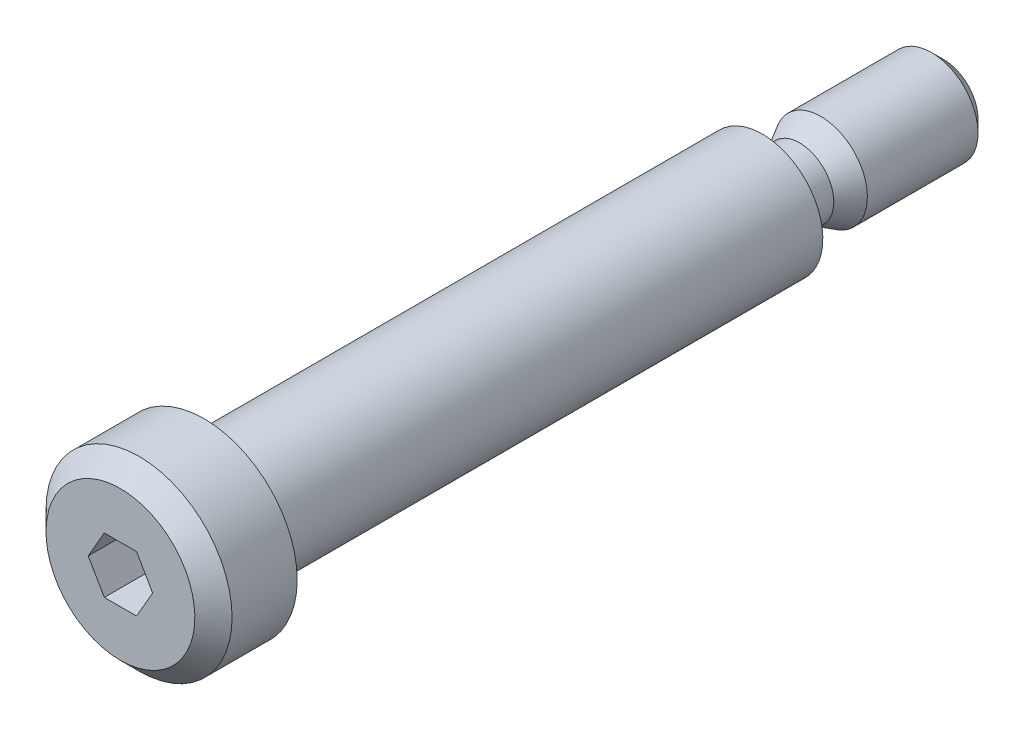
ISO-10303-21;
HEADER;
FILE_DESCRIPTION(('STEP AP214'),'2;1');
FILE_NAME('part.step','',(''),(''),'','','');
FILE_SCHEMA(('AUTOMOTIVE_DESIGN { 1 0 10303 214 1 1 1 1 }'));
ENDSEC;
DATA;
#1=APPLICATION_CONTEXT('core data for automotive mechanical design processes');
#2=APPLICATION_PROTOCOL_DEFINITION('international standard','automotive_design',2000,#1);
#3=PRODUCT_CONTEXT('',#1,'mechanical');
#4=PRODUCT('Part','Part','',(#3));
#5=PRODUCT_RELATED_PRODUCT_CATEGORY('part','',(#4));
#6=PRODUCT_DEFINITION_FORMATION('','',#4);
#7=PRODUCT_DEFINITION_CONTEXT('part definition',#1,'design');
#8=PRODUCT_DEFINITION('design','',#6,#7);
#9=PRODUCT_DEFINITION_SHAPE('','',#8);
#10=(LENGTH_UNIT() NAMED_UNIT(*) SI_UNIT(.MILLI.,.METRE.));
#11=(NAMED_UNIT(*) PLANE_ANGLE_UNIT() SI_UNIT($,.RADIAN.));
#12=(NAMED_UNIT(*) SI_UNIT($,.STERADIAN.) SOLID_ANGLE_UNIT());
#13=UNCERTAINTY_MEASURE_WITH_UNIT(LENGTH_MEASURE(1.E-05),#10,'distance_accuracy_value','');
#14=(GEOMETRIC_REPRESENTATION_CONTEXT(3) GLOBAL_UNCERTAINTY_ASSIGNED_CONTEXT((#13)) GLOBAL_UNIT_ASSIGNED_CONTEXT((#10,
#11,#12)) REPRESENTATION_CONTEXT('',''));
#15=CARTESIAN_POINT('',(0.,0.,0.));
#16=DIRECTION('',(0.,0.,1.));
#17=DIRECTION('',(1.,0.,0.));
#18=AXIS2_PLACEMENT_3D('',#15,#16,#17);
#19=CARTESIAN_POINT('',(0.,0.,-15.40625));
#20=DIRECTION('',(0.,0.,1.));
#21=DIRECTION('',(0.,-1.,0.));
#22=AXIS2_PLACEMENT_3D('',#19,#20,#21);
#23=CYLINDRICAL_SURFACE('',#22,3.25);
#24=CARTESIAN_POINT('',(0.,0.,-0.8125));
#25=DIRECTION('',(0.,0.,-1.));
#26=DIRECTION('',(0.,-1.,0.));
#27=AXIS2_PLACEMENT_3D('',#24,#25,#26);
#28=CIRCLE('',#27,3.25);
#29=CARTESIAN_POINT('',(0.,-3.25,-0.8125));
#30=VERTEX_POINT('',#29);
#31=EDGE_CURVE('E10',#30,#30,#28,.T.);
#32=ORIENTED_EDGE('',*,*,#31,.T.);
#33=EDGE_LOOP('',(#32));
#34=FACE_BOUND('',#33,.T.);
#35=CARTESIAN_POINT('',(0.,0.,-30.));
#36=DIRECTION('',(0.,0.,-1.));
#37=DIRECTION('',(0.,-1.,0.));
#38=AXIS2_PLACEMENT_3D('',#35,#36,#37);
#39=CIRCLE('',#38,3.25);
#40=CARTESIAN_POINT('',(0.,-3.25,-30.));
#41=VERTEX_POINT('',#40);
#42=EDGE_CURVE('E144',#41,#41,#39,.T.);
#43=ORIENTED_EDGE('',*,*,#42,.F.);
#44=EDGE_LOOP('',(#43));
#45=FACE_BOUND('',#44,.T.);
#46=ADVANCED_FACE('F16',(#34,#45),#23,.T.);
#47=CARTESIAN_POINT('',(0.,0.,-0.40625));
#48=DIRECTION('',(0.,0.,-1.));
#49=DIRECTION('',(-1.,0.,0.));
#50=AXIS2_PLACEMENT_3D('',#47,#48,#49);
#51=TOROIDAL_SURFACE('',#50,3.25,0.40625);
#52=CARTESIAN_POINT('',(0.,0.,0.));
#53=DIRECTION('',(0.,0.,-1.));
#54=DIRECTION('',(0.,-1.,0.));
#55=AXIS2_PLACEMENT_3D('',#52,#53,#54);
#56=CIRCLE('',#55,3.25);
#57=CARTESIAN_POINT('',(0.,-3.25,0.));
#58=VERTEX_POINT('',#57);
#59=EDGE_CURVE('E27',#58,#58,#56,.T.);
#60=ORIENTED_EDGE('',*,*,#59,.T.);
#61=EDGE_LOOP('',(#60));
#62=FACE_BOUND('',#61,.T.);
#63=ORIENTED_EDGE('',*,*,#31,.F.);
#64=EDGE_LOOP('',(#63));
#65=FACE_BOUND('',#64,.T.);
#66=ADVANCED_FACE('F288',(#62,#65),#51,.F.);
#67=CARTESIAN_POINT('',(0.,-4.125,0.));
#68=DIRECTION('',(0.,0.,-1.));
#69=DIRECTION('',(0.,-1.,0.));
#70=AXIS2_PLACEMENT_3D('',#67,#68,#69);
#71=PLANE('',#70);
#72=CARTESIAN_POINT('',(0.,0.,0.));
#73=DIRECTION('',(0.,0.,-1.));
#74=DIRECTION('',(0.,-1.,0.));
#75=AXIS2_PLACEMENT_3D('',#72,#73,#74);
#76=CIRCLE('',#75,5.);
#77=CARTESIAN_POINT('',(0.,-5.,0.));
#78=VERTEX_POINT('',#77);
#79=EDGE_CURVE('E112',#78,#78,#76,.T.);
#80=ORIENTED_EDGE('',*,*,#79,.T.);
#81=EDGE_LOOP('',(#80));
#82=FACE_BOUND('',#81,.T.);
#83=ORIENTED_EDGE('',*,*,#59,.F.);
#84=EDGE_LOOP('',(#83));
#85=FACE_BOUND('',#84,.T.);
#86=ADVANCED_FACE('F113',(#82,#85),#71,.T.);
#87=CARTESIAN_POINT('',(0.,0.,1.75));
#88=DIRECTION('',(0.,0.,1.));
#89=DIRECTION('',(0.,-1.,0.));
#90=AXIS2_PLACEMENT_3D('',#87,#88,#89);
#91=CYLINDRICAL_SURFACE('',#90,5.);
#92=CARTESIAN_POINT('',(0.,0.,3.5));
#93=DIRECTION('',(0.,0.,-1.));
#94=DIRECTION('',(0.,-1.,0.));
#95=AXIS2_PLACEMENT_3D('',#92,#93,#94);
#96=CIRCLE('',#95,5.);
#97=CARTESIAN_POINT('',(0.,-5.,3.5));
#98=VERTEX_POINT('',#97);
#99=EDGE_CURVE('E117',#98,#98,#96,.T.);
#100=ORIENTED_EDGE('',*,*,#99,.T.);
#101=EDGE_LOOP('',(#100));
#102=FACE_BOUND('',#101,.T.);
#103=ORIENTED_EDGE('',*,*,#79,.F.);
#104=EDGE_LOOP('',(#103));
#105=FACE_BOUND('',#104,.T.);
#106=ADVANCED_FACE('F309',(#102,#105),#91,.T.);
#107=CARTESIAN_POINT('',(0.,0.,4.));
#108=DIRECTION('',(0.,0.,-1.));
#109=DIRECTION('',(0.,-1.,0.));
#110=AXIS2_PLACEMENT_3D('',#107,#108,#109);
#111=CONICAL_SURFACE('',#110,4.5,0.785398163397448);
#112=CARTESIAN_POINT('',(0.,0.,4.5));
#113=DIRECTION('',(0.,0.,-1.));
#114=DIRECTION('',(0.,-1.,0.));
#115=AXIS2_PLACEMENT_3D('',#112,#113,#114);
#116=CIRCLE('',#115,4.);
#117=CARTESIAN_POINT('',(0.,-4.,4.5));
#118=VERTEX_POINT('',#117);
#119=EDGE_CURVE('E123',#118,#118,#116,.T.);
#120=ORIENTED_EDGE('',*,*,#119,.T.);
#121=EDGE_LOOP('',(#120));
#122=FACE_BOUND('',#121,.T.);
#123=ORIENTED_EDGE('',*,*,#99,.F.);
#124=EDGE_LOOP('',(#123));
#125=FACE_BOUND('',#124,.T.);
#126=ADVANCED_FACE('F312',(#122,#125),#111,.T.);
#127=CARTESIAN_POINT('',(0.,-2.,4.5));
#128=DIRECTION('',(0.,0.,1.));
#129=DIRECTION('',(0.,1.,0.));
#130=AXIS2_PLACEMENT_3D('',#127,#128,#129);
#131=PLANE('',#130);
#132=ORIENTED_EDGE('',*,*,#119,.F.);
#133=EDGE_LOOP('',(#132));
#134=FACE_BOUND('',#133,.T.);
#135=DIRECTION('',(-0.5,0.866025403784439,0.));
#136=VECTOR('',#135,1.);
#137=CARTESIAN_POINT('',(-0.86602479810778,-1.49999965031242,4.5));
#138=LINE('',#137,#136);
#139=CARTESIAN_POINT('',(-0.866025,-1.49999930062484,4.5));
#140=VERTEX_POINT('',#139);
#141=CARTESIAN_POINT('',(-1.73205,0.,4.5));
#142=VERTEX_POINT('',#141);
#143=EDGE_CURVE('E215',#140,#142,#138,.T.);
#144=ORIENTED_EDGE('',*,*,#143,.T.);
#145=DIRECTION('',(0.5,0.866025403784439,0.));
#146=VECTOR('',#145,1.);
#147=CARTESIAN_POINT('',(-1.73205020189222,-3.49687582223979E-07,4.5));
#148=LINE('',#147,#146);
#149=CARTESIAN_POINT('',(-0.866025,1.49999930062484,4.5));
#150=VERTEX_POINT('',#149);
#151=EDGE_CURVE('E180',#142,#150,#148,.T.);
#152=ORIENTED_EDGE('',*,*,#151,.T.);
#153=DIRECTION('',(1.,0.,0.));
#154=VECTOR('',#153,1.);
#155=CARTESIAN_POINT('',(0.,1.49999930062484,4.5));
#156=LINE('',#155,#154);
#157=CARTESIAN_POINT('',(0.866025,1.49999930062484,4.5));
#158=VERTEX_POINT('',#157);
#159=EDGE_CURVE('E222',#150,#158,#156,.T.);
#160=ORIENTED_EDGE('',*,*,#159,.T.);
#161=DIRECTION('',(0.5,-0.866025403784439,0.));
#162=VECTOR('',#161,1.);
#163=CARTESIAN_POINT('',(1.73205020189222,-3.4968758177989E-07,4.5));
#164=LINE('',#163,#162);
#165=CARTESIAN_POINT('',(1.73205,0.,4.5));
#166=VERTEX_POINT('',#165);
#167=EDGE_CURVE('E20',#158,#166,#164,.T.);
#168=ORIENTED_EDGE('',*,*,#167,.T.);
#169=DIRECTION('',(-0.5,-0.866025403784439,0.));
#170=VECTOR('',#169,1.);
#171=CARTESIAN_POINT('',(0.86602479810778,-1.49999965031242,4.5));
#172=LINE('',#171,#170);
#173=CARTESIAN_POINT('',(0.866025,-1.49999930062484,4.5));
#174=VERTEX_POINT('',#173);
#175=EDGE_CURVE('E184',#166,#174,#172,.T.);
#176=ORIENTED_EDGE('',*,*,#175,.T.);
#177=DIRECTION('',(-1.,0.,0.));
#178=VECTOR('',#177,1.);
#179=CARTESIAN_POINT('',(0.,-1.49999930062484,4.5));
#180=LINE('',#179,#178);
#181=EDGE_CURVE('E175',#174,#140,#180,.T.);
#182=ORIENTED_EDGE('',*,*,#181,.T.);
#183=EDGE_LOOP('',(#144,#152,#160,#168,#176,#182));
#184=FACE_BOUND('',#183,.T.);
#185=ADVANCED_FACE('F262',(#134,#184),#131,.T.);
#186=CARTESIAN_POINT('',(0.,0.,-38.1591604654721));
#187=DIRECTION('',(0.,0.,-1.));
#188=DIRECTION('',(0.,-1.,0.));
#189=AXIS2_PLACEMENT_3D('',#186,#187,#188);
#190=CONICAL_SURFACE('',#189,0.208333333333336,1.22173047639602);
#191=CARTESIAN_POINT('',(0.,0.,-38.2349875976109));
#192=DIRECTION('',(0.,0.,-1.));
#193=DIRECTION('',(0.,-1.,0.));
#194=AXIS2_PLACEMENT_3D('',#191,#192,#193);
#195=CIRCLE('',#194,0.416666666666667);
#196=CARTESIAN_POINT('',(0.,-0.416666666666667,-38.2349875976109));
#197=VERTEX_POINT('',#196);
#198=EDGE_CURVE('E142',#197,#197,#195,.T.);
#199=ORIENTED_EDGE('',*,*,#198,.T.);
#200=EDGE_LOOP('',(#199));
#201=FACE_BOUND('',#200,.T.);
#202=CARTESIAN_POINT('',(0.,0.,-38.0833333333333));
#203=VERTEX_POINT('',#202);
#204=VERTEX_LOOP('',#203);
#205=FACE_BOUND('',#204,.T.);
#206=ADVANCED_FACE('F322',(#201,#205),#190,.F.);
#207=CARTESIAN_POINT('',(0.,0.,-38.6841604654721));
#208=DIRECTION('',(0.,0.,1.));
#209=DIRECTION('',(0.,-1.,0.));
#210=AXIS2_PLACEMENT_3D('',#207,#208,#209);
#211=CYLINDRICAL_SURFACE('',#210,0.41666666666667);
#212=CARTESIAN_POINT('',(0.,0.,-39.1333333333334));
#213=DIRECTION('',(0.,0.,-1.));
#214=DIRECTION('',(0.,-1.,0.));
#215=AXIS2_PLACEMENT_3D('',#212,#213,#214);
#216=CIRCLE('',#215,0.416666666666672);
#217=CARTESIAN_POINT('',(0.,-0.416666666666672,-39.1333333333334));
#218=VERTEX_POINT('',#217);
#219=EDGE_CURVE('E136',#218,#218,#216,.T.);
#220=ORIENTED_EDGE('',*,*,#219,.T.);
#221=EDGE_LOOP('',(#220));
#222=FACE_BOUND('',#221,.T.);
#223=ORIENTED_EDGE('',*,*,#198,.F.);
#224=EDGE_LOOP('',(#223));
#225=FACE_BOUND('',#224,.T.);
#226=ADVANCED_FACE('F303',(#222,#225),#211,.F.);
#227=CARTESIAN_POINT('',(0.,0.,-39.4416666666667));
#228=DIRECTION('',(0.,0.,-1.));
#229=DIRECTION('',(0.,-1.,0.));
#230=AXIS2_PLACEMENT_3D('',#227,#228,#229);
#231=CONICAL_SURFACE('',#230,0.594682999666808,0.5235987755983);
#232=CARTESIAN_POINT('',(0.,0.,-39.75));
#233=DIRECTION('',(0.,0.,-1.));
#234=DIRECTION('',(0.,-1.,0.));
#235=AXIS2_PLACEMENT_3D('',#232,#233,#234);
#236=CIRCLE('',#235,0.772699332666945);
#237=CARTESIAN_POINT('',(0.,-0.772699332666945,-39.75));
#238=VERTEX_POINT('',#237);
#239=EDGE_CURVE('E143',#238,#238,#236,.T.);
#240=ORIENTED_EDGE('',*,*,#239,.T.);
#241=EDGE_LOOP('',(#240));
#242=FACE_BOUND('',#241,.T.);
#243=ORIENTED_EDGE('',*,*,#219,.F.);
#244=EDGE_LOOP('',(#243));
#245=FACE_BOUND('',#244,.T.);
#246=ADVANCED_FACE('F299',(#242,#245),#231,.F.);
#247=CARTESIAN_POINT('',(0.,-1.30634966633347,-39.75));
#248=DIRECTION('',(0.,0.,-1.));
#249=DIRECTION('',(0.,-1.,0.));
#250=AXIS2_PLACEMENT_3D('',#247,#248,#249);
#251=PLANE('',#250);
#252=CARTESIAN_POINT('',(0.,0.,-39.75));
#253=DIRECTION('',(0.,0.,-1.));
#254=DIRECTION('',(0.,-1.,0.));
#255=AXIS2_PLACEMENT_3D('',#252,#253,#254);
#256=CIRCLE('',#255,1.84);
#257=CARTESIAN_POINT('',(0.,-1.84,-39.75));
#258=VERTEX_POINT('',#257);
#259=EDGE_CURVE('E152',#258,#258,#256,.T.);
#260=ORIENTED_EDGE('',*,*,#259,.T.);
#261=EDGE_LOOP('',(#260));
#262=FACE_BOUND('',#261,.T.);
#263=ORIENTED_EDGE('',*,*,#239,.F.);
#264=EDGE_LOOP('',(#263));
#265=FACE_BOUND('',#264,.T.);
#266=ADVANCED_FACE('F302',(#262,#265),#251,.T.);
#267=CARTESIAN_POINT('',(0.,0.,-39.42));
#268=DIRECTION('',(0.,0.,1.));
#269=DIRECTION('',(0.,-1.,0.));
#270=AXIS2_PLACEMENT_3D('',#267,#268,#269);
#271=CONICAL_SURFACE('',#270,2.17,0.785398163397456);
#272=CARTESIAN_POINT('',(0.,0.,-39.09));
#273=DIRECTION('',(0.,0.,-1.));
#274=DIRECTION('',(0.,-1.,0.));
#275=AXIS2_PLACEMENT_3D('',#272,#273,#274);
#276=CIRCLE('',#275,2.5);
#277=CARTESIAN_POINT('',(0.,-2.5,-39.09));
#278=VERTEX_POINT('',#277);
#279=EDGE_CURVE('E149',#278,#278,#276,.T.);
#280=ORIENTED_EDGE('',*,*,#279,.T.);
#281=EDGE_LOOP('',(#280));
#282=FACE_BOUND('',#281,.T.);
#283=ORIENTED_EDGE('',*,*,#259,.F.);
#284=EDGE_LOOP('',(#283));
#285=FACE_BOUND('',#284,.T.);
#286=ADVANCED_FACE('F307',(#282,#285),#271,.T.);
#287=CARTESIAN_POINT('',(0.,0.,-36.1165767664978));
#288=DIRECTION('',(0.,0.,1.));
#289=DIRECTION('',(0.,-1.,0.));
#290=AXIS2_PLACEMENT_3D('',#287,#288,#289);
#291=CYLINDRICAL_SURFACE('',#290,2.5);
#292=CARTESIAN_POINT('',(0.,0.,-33.1431535329954));
#293=DIRECTION('',(0.,0.,-1.));
#294=DIRECTION('',(0.,-1.,0.));
#295=AXIS2_PLACEMENT_3D('',#292,#293,#294);
#296=CIRCLE('',#295,2.5);
#297=CARTESIAN_POINT('',(0.,-2.5,-33.1431535329954));
#298=VERTEX_POINT('',#297);
#299=EDGE_CURVE('E127',#298,#298,#296,.T.);
#300=ORIENTED_EDGE('',*,*,#299,.T.);
#301=EDGE_LOOP('',(#300));
#302=FACE_BOUND('',#301,.T.);
#303=ORIENTED_EDGE('',*,*,#279,.F.);
#304=EDGE_LOOP('',(#303));
#305=FACE_BOUND('',#304,.T.);
#306=ADVANCED_FACE('F336',(#302,#305),#291,.T.);
#307=CARTESIAN_POINT('',(0.,0.,-32.5715767664977));
#308=DIRECTION('',(0.,0.,-1.));
#309=DIRECTION('',(0.,-1.,0.));
#310=AXIS2_PLACEMENT_3D('',#307,#308,#309);
#311=CONICAL_SURFACE('',#310,2.17,0.523598775598299);
#312=CARTESIAN_POINT('',(0.,0.,-32.));
#313=DIRECTION('',(0.,0.,-1.));
#314=DIRECTION('',(0.,-1.,0.));
#315=AXIS2_PLACEMENT_3D('',#312,#313,#314);
#316=CIRCLE('',#315,1.84);
#317=CARTESIAN_POINT('',(0.,-1.84,-32.));
#318=VERTEX_POINT('',#317);
#319=EDGE_CURVE('E209',#318,#318,#316,.T.);
#320=ORIENTED_EDGE('',*,*,#319,.T.);
#321=EDGE_LOOP('',(#320));
#322=FACE_BOUND('',#321,.T.);
#323=ORIENTED_EDGE('',*,*,#299,.F.);
#324=EDGE_LOOP('',(#323));
#325=FACE_BOUND('',#324,.T.);
#326=ADVANCED_FACE('F329',(#322,#325),#311,.T.);
#327=CARTESIAN_POINT('',(0.,0.,-31.25));
#328=DIRECTION('',(0.,0.,1.));
#329=DIRECTION('',(0.,-1.,0.));
#330=AXIS2_PLACEMENT_3D('',#327,#328,#329);
#331=CYLINDRICAL_SURFACE('',#330,1.84);
#332=CARTESIAN_POINT('',(0.,0.,-30.5));
#333=DIRECTION('',(0.,0.,-1.));
#334=DIRECTION('',(0.,-1.,0.));
#335=AXIS2_PLACEMENT_3D('',#332,#333,#334);
#336=CIRCLE('',#335,1.84);
#337=CARTESIAN_POINT('',(0.,-1.84,-30.5));
#338=VERTEX_POINT('',#337);
#339=EDGE_CURVE('E147',#338,#338,#336,.T.);
#340=ORIENTED_EDGE('',*,*,#339,.T.);
#341=EDGE_LOOP('',(#340));
#342=FACE_BOUND('',#341,.T.);
#343=ORIENTED_EDGE('',*,*,#319,.F.);
#344=EDGE_LOOP('',(#343));
#345=FACE_BOUND('',#344,.T.);
#346=ADVANCED_FACE('F317',(#342,#345),#331,.T.);
#347=CARTESIAN_POINT('',(0.,0.,-30.5));
#348=DIRECTION('',(0.,0.,-1.));
#349=DIRECTION('',(-1.,0.,0.));
#350=AXIS2_PLACEMENT_3D('',#347,#348,#349);
#351=TOROIDAL_SURFACE('',#350,2.34,0.5);
#352=CARTESIAN_POINT('',(0.,0.,-30.));
#353=DIRECTION('',(0.,0.,-1.));
#354=DIRECTION('',(0.,-1.,0.));
#355=AXIS2_PLACEMENT_3D('',#352,#353,#354);
#356=CIRCLE('',#355,2.34);
#357=CARTESIAN_POINT('',(0.,-2.34,-30.));
#358=VERTEX_POINT('',#357);
#359=EDGE_CURVE('E148',#358,#358,#356,.T.);
#360=ORIENTED_EDGE('',*,*,#359,.T.);
#361=EDGE_LOOP('',(#360));
#362=FACE_BOUND('',#361,.T.);
#363=ORIENTED_EDGE('',*,*,#339,.F.);
#364=EDGE_LOOP('',(#363));
#365=FACE_BOUND('',#364,.T.);
#366=ADVANCED_FACE('F314',(#362,#365),#351,.F.);
#367=CARTESIAN_POINT('',(0.,-2.795,-30.));
#368=DIRECTION('',(0.,0.,-1.));
#369=DIRECTION('',(0.,-1.,0.));
#370=AXIS2_PLACEMENT_3D('',#367,#368,#369);
#371=PLANE('',#370);
#372=ORIENTED_EDGE('',*,*,#42,.T.);
#373=EDGE_LOOP('',(#372));
#374=FACE_BOUND('',#373,.T.);
#375=ORIENTED_EDGE('',*,*,#359,.F.);
#376=EDGE_LOOP('',(#375));
#377=FACE_BOUND('',#376,.T.);
#378=ADVANCED_FACE('F316',(#374,#377),#371,.T.);
#379=CARTESIAN_POINT('',(-1.2990375,0.749999650312418,4.5));
#380=DIRECTION('',(-0.866025403784439,0.5,0.));
#381=DIRECTION('',(0.5,0.866025403784439,0.));
#382=AXIS2_PLACEMENT_3D('',#379,#380,#381);
#383=PLANE('',#382);
#384=CARTESIAN_POINT('',(-1.73205,0.,2.1));
#385=CARTESIAN_POINT('',(-1.2990375,0.749999650312423,1.85000011656253));
#386=CARTESIAN_POINT('',(-0.866025,1.49999930062484,2.1));
#387=(BOUNDED_CURVE() B_SPLINE_CURVE(2,(#384,#385,#386),.UNSPECIFIED.,.F.,
.F.) B_SPLINE_CURVE_WITH_KNOTS((3,3),(0.,1.75265338994167),
.UNSPECIFIED.) CURVE() GEOMETRIC_REPRESENTATION_ITEM() RATIONAL_B_SPLINE_CURVE((1.,
1.15470053837924,1.)) REPRESENTATION_ITEM(''));
#388=CARTESIAN_POINT('',(-1.73205,0.,2.1));
#389=VERTEX_POINT('',#388);
#390=CARTESIAN_POINT('',(-0.866025,1.49999930062484,2.1));
#391=VERTEX_POINT('',#390);
#392=EDGE_CURVE('E160',#389,#391,#387,.T.);
#393=ORIENTED_EDGE('',*,*,#392,.T.);
#394=DIRECTION('',(0.,0.,-1.));
#395=VECTOR('',#394,1.);
#396=CARTESIAN_POINT('',(-0.866025,1.49999930062484,4.5));
#397=LINE('',#396,#395);
#398=EDGE_CURVE('E183',#150,#391,#397,.T.);
#399=ORIENTED_EDGE('',*,*,#398,.F.);
#400=ORIENTED_EDGE('',*,*,#151,.F.);
#401=DIRECTION('',(0.,0.,-1.));
#402=VECTOR('',#401,1.);
#403=CARTESIAN_POINT('',(-1.73205,0.,4.5));
#404=LINE('',#403,#402);
#405=EDGE_CURVE('E212',#142,#389,#404,.T.);
#406=ORIENTED_EDGE('',*,*,#405,.T.);
#407=EDGE_LOOP('',(#393,#399,#400,#406));
#408=FACE_BOUND('',#407,.T.);
#409=ADVANCED_FACE('F270',(#408),#383,.F.);
#410=CARTESIAN_POINT('',(0.,1.49999930062484,4.5));
#411=DIRECTION('',(0.,1.,0.));
#412=DIRECTION('',(1.,0.,0.));
#413=AXIS2_PLACEMENT_3D('',#410,#411,#412);
#414=PLANE('',#413);
#415=CARTESIAN_POINT('',(-0.866025,1.49999930062484,2.1));
#416=CARTESIAN_POINT('',(0.,1.49999930062483,1.85000011656252));
#417=CARTESIAN_POINT('',(0.866025,1.49999930062484,2.1));
#418=(BOUNDED_CURVE() B_SPLINE_CURVE(2,(#415,#416,#417),.UNSPECIFIED.,.F.,
.F.) B_SPLINE_CURVE_WITH_KNOTS((3,3),(0.,1.75265338994166),
.UNSPECIFIED.) CURVE() GEOMETRIC_REPRESENTATION_ITEM() RATIONAL_B_SPLINE_CURVE((1.,
1.15470053837925,1.)) REPRESENTATION_ITEM(''));
#419=CARTESIAN_POINT('',(0.866025,1.49999930062484,2.1));
#420=VERTEX_POINT('',#419);
#421=EDGE_CURVE('E135',#391,#420,#418,.T.);
#422=ORIENTED_EDGE('',*,*,#421,.T.);
#423=DIRECTION('',(0.,0.,-1.));
#424=VECTOR('',#423,1.);
#425=CARTESIAN_POINT('',(0.866025,1.49999930062484,4.5));
#426=LINE('',#425,#424);
#427=EDGE_CURVE('E224',#158,#420,#426,.T.);
#428=ORIENTED_EDGE('',*,*,#427,.F.);
#429=ORIENTED_EDGE('',*,*,#159,.F.);
#430=ORIENTED_EDGE('',*,*,#398,.T.);
#431=EDGE_LOOP('',(#422,#428,#429,#430));
#432=FACE_BOUND('',#431,.T.);
#433=ADVANCED_FACE('F267',(#432),#414,.F.);
#434=CARTESIAN_POINT('',(1.2990375,0.749999650312418,4.5));
#435=DIRECTION('',(0.866025403784439,0.5,0.));
#436=DIRECTION('',(0.5,-0.866025403784439,0.));
#437=AXIS2_PLACEMENT_3D('',#434,#435,#436);
#438=PLANE('',#437);
#439=CARTESIAN_POINT('',(0.866025,1.49999930062484,2.1));
#440=CARTESIAN_POINT('',(1.2990375,0.749999650312423,1.85000011656253));
#441=CARTESIAN_POINT('',(1.73205,0.,2.1));
#442=(BOUNDED_CURVE() B_SPLINE_CURVE(2,(#439,#440,#441),.UNSPECIFIED.,.F.,
.F.) B_SPLINE_CURVE_WITH_KNOTS((3,3),(0.,1.75265338994166),
.UNSPECIFIED.) CURVE() GEOMETRIC_REPRESENTATION_ITEM() RATIONAL_B_SPLINE_CURVE((1.,
1.15470053837924,1.)) REPRESENTATION_ITEM(''));
#443=CARTESIAN_POINT('',(1.73205,0.,2.1));
#444=VERTEX_POINT('',#443);
#445=EDGE_CURVE('E129',#420,#444,#442,.T.);
#446=ORIENTED_EDGE('',*,*,#445,.T.);
#447=DIRECTION('',(0.,0.,-1.));
#448=VECTOR('',#447,1.);
#449=CARTESIAN_POINT('',(1.73205,0.,4.5));
#450=LINE('',#449,#448);
#451=EDGE_CURVE('E187',#166,#444,#450,.T.);
#452=ORIENTED_EDGE('',*,*,#451,.F.);
#453=ORIENTED_EDGE('',*,*,#167,.F.);
#454=ORIENTED_EDGE('',*,*,#427,.T.);
#455=EDGE_LOOP('',(#446,#452,#453,#454));
#456=FACE_BOUND('',#455,.T.);
#457=ADVANCED_FACE('F264',(#456),#438,.F.);
#458=CARTESIAN_POINT('',(1.2990375,-0.749999650312419,4.5));
#459=DIRECTION('',(0.866025403784439,-0.5,0.));
#460=DIRECTION('',(-0.5,-0.866025403784439,0.));
#461=AXIS2_PLACEMENT_3D('',#458,#459,#460);
#462=PLANE('',#461);
#463=CARTESIAN_POINT('',(1.73205,0.,2.1));
#464=CARTESIAN_POINT('',(1.2990375,-0.749999650312419,1.85000011656253));
#465=CARTESIAN_POINT('',(0.866025,-1.49999930062484,2.1));
#466=(BOUNDED_CURVE() B_SPLINE_CURVE(2,(#463,#464,#465),.UNSPECIFIED.,.F.,
.F.) B_SPLINE_CURVE_WITH_KNOTS((3,3),(0.,1.75265338994166),
.UNSPECIFIED.) CURVE() GEOMETRIC_REPRESENTATION_ITEM() RATIONAL_B_SPLINE_CURVE((1.,
1.15470053837925,1.)) REPRESENTATION_ITEM(''));
#467=CARTESIAN_POINT('',(0.866025,-1.49999930062484,2.1));
#468=VERTEX_POINT('',#467);
#469=EDGE_CURVE('E169',#444,#468,#466,.T.);
#470=ORIENTED_EDGE('',*,*,#469,.T.);
#471=DIRECTION('',(0.,0.,-1.));
#472=VECTOR('',#471,1.);
#473=CARTESIAN_POINT('',(0.866025,-1.49999930062484,4.5));
#474=LINE('',#473,#472);
#475=EDGE_CURVE('E178',#174,#468,#474,.T.);
#476=ORIENTED_EDGE('',*,*,#475,.F.);
#477=ORIENTED_EDGE('',*,*,#175,.F.);
#478=ORIENTED_EDGE('',*,*,#451,.T.);
#479=EDGE_LOOP('',(#470,#476,#477,#478));
#480=FACE_BOUND('',#479,.T.);
#481=ADVANCED_FACE('F18',(#480),#462,.F.);
#482=CARTESIAN_POINT('',(0.,-1.49999930062484,4.5));
#483=DIRECTION('',(0.,-1.,0.));
#484=DIRECTION('',(-1.,0.,0.));
#485=AXIS2_PLACEMENT_3D('',#482,#483,#484);
#486=PLANE('',#485);
#487=CARTESIAN_POINT('',(0.866025,-1.49999930062484,2.1));
#488=CARTESIAN_POINT('',(0.,-1.49999930062484,1.85000011656253));
#489=CARTESIAN_POINT('',(-0.866025,-1.49999930062484,2.1));
#490=(BOUNDED_CURVE() B_SPLINE_CURVE(2,(#487,#488,#489),.UNSPECIFIED.,.F.,
.F.) B_SPLINE_CURVE_WITH_KNOTS((3,3),(0.,1.75265338994166),
.UNSPECIFIED.) CURVE() GEOMETRIC_REPRESENTATION_ITEM() RATIONAL_B_SPLINE_CURVE((1.,
1.15470053837925,1.)) REPRESENTATION_ITEM(''));
#491=CARTESIAN_POINT('',(-0.866025,-1.49999930062484,2.1));
#492=VERTEX_POINT('',#491);
#493=EDGE_CURVE('E159',#468,#492,#490,.T.);
#494=ORIENTED_EDGE('',*,*,#493,.T.);
#495=DIRECTION('',(0.,0.,-1.));
#496=VECTOR('',#495,1.);
#497=CARTESIAN_POINT('',(-0.866025,-1.49999930062484,4.5));
#498=LINE('',#497,#496);
#499=EDGE_CURVE('E179',#140,#492,#498,.T.);
#500=ORIENTED_EDGE('',*,*,#499,.F.);
#501=ORIENTED_EDGE('',*,*,#181,.F.);
#502=ORIENTED_EDGE('',*,*,#475,.T.);
#503=EDGE_LOOP('',(#494,#500,#501,#502));
#504=FACE_BOUND('',#503,.T.);
#505=ADVANCED_FACE('F259',(#504),#486,.F.);
#506=CARTESIAN_POINT('',(-1.2990375,-0.749999650312419,4.5));
#507=DIRECTION('',(-0.866025403784439,-0.5,0.));
#508=DIRECTION('',(-0.5,0.866025403784439,0.));
#509=AXIS2_PLACEMENT_3D('',#506,#507,#508);
#510=PLANE('',#509);
#511=CARTESIAN_POINT('',(-0.866025,-1.49999930062483,2.1));
#512=CARTESIAN_POINT('',(-1.2990375,-0.749999650312416,1.85000011656253));
#513=CARTESIAN_POINT('',(-1.73205,0.,2.1));
#514=(BOUNDED_CURVE() B_SPLINE_CURVE(2,(#511,#512,#513),.UNSPECIFIED.,.F.,
.F.) B_SPLINE_CURVE_WITH_KNOTS((3,3),(0.,1.75265338994165),
.UNSPECIFIED.) CURVE() GEOMETRIC_REPRESENTATION_ITEM() RATIONAL_B_SPLINE_CURVE((1.,
1.15470053837926,1.)) REPRESENTATION_ITEM(''));
#515=EDGE_CURVE('E153',#492,#389,#514,.T.);
#516=ORIENTED_EDGE('',*,*,#515,.T.);
#517=ORIENTED_EDGE('',*,*,#405,.F.);
#518=ORIENTED_EDGE('',*,*,#143,.F.);
#519=ORIENTED_EDGE('',*,*,#499,.T.);
#520=EDGE_LOOP('',(#516,#517,#518,#519));
#521=FACE_BOUND('',#520,.T.);
#522=ADVANCED_FACE('F272',(#521),#510,.F.);
#523=CARTESIAN_POINT('',(0.,0.,1.60000023312505));
#524=DIRECTION('',(0.,0.,1.));
#525=DIRECTION('',(0.,1.,0.));
#526=AXIS2_PLACEMENT_3D('',#523,#524,#525);
#527=CONICAL_SURFACE('',#526,0.866025,1.0471975511966);
#528=CARTESIAN_POINT('',(0.,0.,1.10000046625011));
#529=VERTEX_POINT('',#528);
#530=VERTEX_LOOP('',#529);
#531=FACE_BOUND('',#530,.T.);
#532=ORIENTED_EDGE('',*,*,#445,.F.);
#533=ORIENTED_EDGE('',*,*,#421,.F.);
#534=ORIENTED_EDGE('',*,*,#392,.F.);
#535=ORIENTED_EDGE('',*,*,#515,.F.);
#536=ORIENTED_EDGE('',*,*,#493,.F.);
#537=ORIENTED_EDGE('',*,*,#469,.F.);
#538=EDGE_LOOP('',(#532,#533,#534,#535,#536,#537));
#539=FACE_BOUND('',#538,.T.);
#540=ADVANCED_FACE('F255',(#531,#539),#527,.F.);
#541=CLOSED_SHELL('',(#46,#66,#86,#106,#126,#185,#206,#226,#246,#266,#286,#306,#326,#346,#366,
#378,#409,#433,#457,#481,#505,#522,#540));
#542=MANIFOLD_SOLID_BREP('B1',#541);
#543=ADVANCED_BREP_SHAPE_REPRESENTATION('',(#18,#542),#14);
#544=SHAPE_DEFINITION_REPRESENTATION(#9,#543);
ENDSEC;
END-ISO-10303-21;
